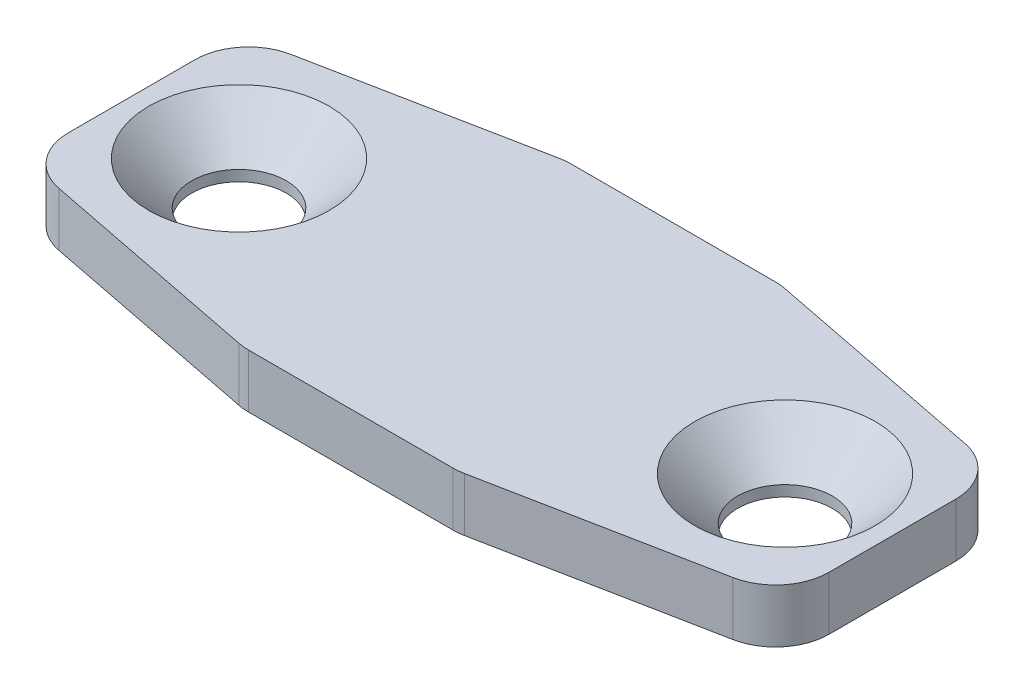
ISO-10303-21;
HEADER;
FILE_DESCRIPTION(('STEP AP214'),'2;1');
FILE_NAME('part.step','',(''),(''),'','','');
FILE_SCHEMA(('AUTOMOTIVE_DESIGN { 1 0 10303 214 1 1 1 1 }'));
ENDSEC;
DATA;
#1=APPLICATION_CONTEXT('core data for automotive mechanical design processes');
#2=APPLICATION_PROTOCOL_DEFINITION('international standard','automotive_design',2000,#1);
#3=PRODUCT_CONTEXT('',#1,'mechanical');
#4=PRODUCT('Part','Part','',(#3));
#5=PRODUCT_RELATED_PRODUCT_CATEGORY('part','',(#4));
#6=PRODUCT_DEFINITION_FORMATION('','',#4);
#7=PRODUCT_DEFINITION_CONTEXT('part definition',#1,'design');
#8=PRODUCT_DEFINITION('design','',#6,#7);
#9=PRODUCT_DEFINITION_SHAPE('','',#8);
#10=(LENGTH_UNIT() NAMED_UNIT(*) SI_UNIT(.MILLI.,.METRE.));
#11=(NAMED_UNIT(*) PLANE_ANGLE_UNIT() SI_UNIT($,.RADIAN.));
#12=(NAMED_UNIT(*) SI_UNIT($,.STERADIAN.) SOLID_ANGLE_UNIT());
#13=UNCERTAINTY_MEASURE_WITH_UNIT(LENGTH_MEASURE(1.E-05),#10,'distance_accuracy_value','');
#14=(GEOMETRIC_REPRESENTATION_CONTEXT(3) GLOBAL_UNCERTAINTY_ASSIGNED_CONTEXT((#13)) GLOBAL_UNIT_ASSIGNED_CONTEXT((#10,
#11,#12)) REPRESENTATION_CONTEXT('',''));
#15=CARTESIAN_POINT('',(0.,0.,0.));
#16=DIRECTION('',(0.,0.,1.));
#17=DIRECTION('',(1.,0.,0.));
#18=AXIS2_PLACEMENT_3D('',#15,#16,#17);
#19=CARTESIAN_POINT('',(-5.,2.5,-7.5));
#20=DIRECTION('',(0.,0.,1.));
#21=DIRECTION('',(1.,0.,0.));
#22=AXIS2_PLACEMENT_3D('',#19,#20,#21);
#23=PLANE('',#22);
#24=DIRECTION('',(-1.,0.,0.));
#25=VECTOR('',#24,1.);
#26=CARTESIAN_POINT('',(-5.,2.5,-7.5));
#27=LINE('',#26,#25);
#28=CARTESIAN_POINT('',(4.75627565188442,2.5,-7.5));
#29=VERTEX_POINT('',#28);
#30=CARTESIAN_POINT('',(-4.75627565188443,2.5,-7.5));
#31=VERTEX_POINT('',#30);
#32=EDGE_CURVE('E238',#29,#31,#27,.T.);
#33=ORIENTED_EDGE('',*,*,#32,.F.);
#34=DIRECTION('',(0.,-1.,0.));
#35=VECTOR('',#34,1.);
#36=CARTESIAN_POINT('',(4.75627565188442,2.5,-7.5));
#37=LINE('',#36,#35);
#38=CARTESIAN_POINT('',(4.75627565188442,0.,-7.5));
#39=VERTEX_POINT('',#38);
#40=EDGE_CURVE('E327',#29,#39,#37,.T.);
#41=ORIENTED_EDGE('',*,*,#40,.T.);
#42=DIRECTION('',(-1.,0.,0.));
#43=VECTOR('',#42,1.);
#44=CARTESIAN_POINT('',(-5.,0.,-7.5));
#45=LINE('',#44,#43);
#46=CARTESIAN_POINT('',(-4.75627565188443,0.,-7.5));
#47=VERTEX_POINT('',#46);
#48=EDGE_CURVE('E366',#39,#47,#45,.T.);
#49=ORIENTED_EDGE('',*,*,#48,.T.);
#50=DIRECTION('',(0.,-1.,0.));
#51=VECTOR('',#50,1.);
#52=CARTESIAN_POINT('',(-4.75627565188443,2.5,-7.5));
#53=LINE('',#52,#51);
#54=EDGE_CURVE('E324',#47,#31,#53,.F.);
#55=ORIENTED_EDGE('',*,*,#54,.T.);
#56=EDGE_LOOP('',(#33,#41,#49,#55));
#57=FACE_BOUND('',#56,.T.);
#58=ADVANCED_FACE('F41',(#57),#23,.F.);
#59=CARTESIAN_POINT('',(-17.7,2.5,-5.));
#60=DIRECTION('',(0.193143791752948,0.,0.981170462104977));
#61=DIRECTION('',(0.981170462104977,0.,-0.193143791752948));
#62=AXIS2_PLACEMENT_3D('',#59,#60,#61);
#63=PLANE('',#62);
#64=DIRECTION('',(-0.981170462104977,0.,0.193143791752948));
#65=VECTOR('',#64,1.);
#66=CARTESIAN_POINT('',(-17.7,2.5,-5.));
#67=LINE('',#66,#65);
#68=CARTESIAN_POINT('',(-5.2391351312668,2.5,-7.45292615526244));
#69=VERTEX_POINT('',#68);
#70=CARTESIAN_POINT('',(-15.6828594793824,2.5,-5.39707490563339));
#71=VERTEX_POINT('',#70);
#72=EDGE_CURVE('E357',#69,#71,#67,.T.);
#73=ORIENTED_EDGE('',*,*,#72,.F.);
#74=DIRECTION('',(0.,-1.,0.));
#75=VECTOR('',#74,1.);
#76=CARTESIAN_POINT('',(-5.23913513126679,2.5,-7.45292615526244));
#77=LINE('',#76,#75);
#78=CARTESIAN_POINT('',(-5.2391351312668,0.,-7.45292615526244));
#79=VERTEX_POINT('',#78);
#80=EDGE_CURVE('E334',#69,#79,#77,.T.);
#81=ORIENTED_EDGE('',*,*,#80,.T.);
#82=DIRECTION('',(-0.981170462104977,0.,0.193143791752948));
#83=VECTOR('',#82,1.);
#84=CARTESIAN_POINT('',(-17.7,0.,-5.));
#85=LINE('',#84,#83);
#86=CARTESIAN_POINT('',(-15.6828594793824,0.,-5.39707490563339));
#87=VERTEX_POINT('',#86);
#88=EDGE_CURVE('E364',#79,#87,#85,.T.);
#89=ORIENTED_EDGE('',*,*,#88,.T.);
#90=DIRECTION('',(0.,-1.,0.));
#91=VECTOR('',#90,1.);
#92=CARTESIAN_POINT('',(-15.6828594793824,2.5,-5.39707490563339));
#93=LINE('',#92,#91);
#94=EDGE_CURVE('E331',#87,#71,#93,.F.);
#95=ORIENTED_EDGE('',*,*,#94,.T.);
#96=EDGE_LOOP('',(#73,#81,#89,#95));
#97=FACE_BOUND('',#96,.T.);
#98=ADVANCED_FACE('F416',(#97),#63,.F.);
#99=CARTESIAN_POINT('',(-17.7,2.5,-5.));
#100=DIRECTION('',(1.,0.,0.));
#101=DIRECTION('',(0.,0.,-1.));
#102=AXIS2_PLACEMENT_3D('',#99,#100,#101);
#103=PLANE('',#102);
#104=DIRECTION('',(0.,0.,1.));
#105=VECTOR('',#104,1.);
#106=CARTESIAN_POINT('',(-17.7,2.5,-5.));
#107=LINE('',#106,#105);
#108=CARTESIAN_POINT('',(-17.7,2.5,-2.94414875037095));
#109=VERTEX_POINT('',#108);
#110=CARTESIAN_POINT('',(-17.7,2.5,2.94414875037095));
#111=VERTEX_POINT('',#110);
#112=EDGE_CURVE('E346',#109,#111,#107,.T.);
#113=ORIENTED_EDGE('',*,*,#112,.F.);
#114=DIRECTION('',(0.,-1.,0.));
#115=VECTOR('',#114,1.);
#116=CARTESIAN_POINT('',(-17.7,2.5,-2.94414875037095));
#117=LINE('',#116,#115);
#118=CARTESIAN_POINT('',(-17.7,0.,-2.94414875037095));
#119=VERTEX_POINT('',#118);
#120=EDGE_CURVE('E11',#109,#119,#117,.T.);
#121=ORIENTED_EDGE('',*,*,#120,.T.);
#122=DIRECTION('',(0.,0.,1.));
#123=VECTOR('',#122,1.);
#124=CARTESIAN_POINT('',(-17.7,0.,-5.));
#125=LINE('',#124,#123);
#126=CARTESIAN_POINT('',(-17.7,0.,2.94414875037095));
#127=VERTEX_POINT('',#126);
#128=EDGE_CURVE('E228',#119,#127,#125,.T.);
#129=ORIENTED_EDGE('',*,*,#128,.T.);
#130=DIRECTION('',(0.,-1.,0.));
#131=VECTOR('',#130,1.);
#132=CARTESIAN_POINT('',(-17.7,2.5,2.94414875037095));
#133=LINE('',#132,#131);
#134=EDGE_CURVE('E50',#127,#111,#133,.F.);
#135=ORIENTED_EDGE('',*,*,#134,.T.);
#136=EDGE_LOOP('',(#113,#121,#129,#135));
#137=FACE_BOUND('',#136,.T.);
#138=ADVANCED_FACE('F345',(#137),#103,.F.);
#139=CARTESIAN_POINT('',(-17.7,2.5,5.));
#140=DIRECTION('',(0.193143791752948,0.,-0.981170462104977));
#141=DIRECTION('',(-0.981170462104977,0.,-0.193143791752948));
#142=AXIS2_PLACEMENT_3D('',#139,#140,#141);
#143=PLANE('',#142);
#144=DIRECTION('',(0.981170462104977,0.,0.193143791752948));
#145=VECTOR('',#144,1.);
#146=CARTESIAN_POINT('',(-17.7,0.,5.));
#147=LINE('',#146,#145);
#148=CARTESIAN_POINT('',(-15.6828594793824,0.,5.39707490563339));
#149=VERTEX_POINT('',#148);
#150=CARTESIAN_POINT('',(-5.2391351312668,0.,7.45292615526244));
#151=VERTEX_POINT('',#150);
#152=EDGE_CURVE('E219',#149,#151,#147,.T.);
#153=ORIENTED_EDGE('',*,*,#152,.T.);
#154=DIRECTION('',(0.,-1.,0.));
#155=VECTOR('',#154,1.);
#156=CARTESIAN_POINT('',(-5.2391351312668,2.5,7.45292615526244));
#157=LINE('',#156,#155);
#158=CARTESIAN_POINT('',(-5.2391351312668,2.5,7.45292615526244));
#159=VERTEX_POINT('',#158);
#160=EDGE_CURVE('E194',#151,#159,#157,.F.);
#161=ORIENTED_EDGE('',*,*,#160,.T.);
#162=DIRECTION('',(0.981170462104977,0.,0.193143791752948));
#163=VECTOR('',#162,1.);
#164=CARTESIAN_POINT('',(-17.7,2.5,5.));
#165=LINE('',#164,#163);
#166=CARTESIAN_POINT('',(-15.6828594793824,2.5,5.39707490563339));
#167=VERTEX_POINT('',#166);
#168=EDGE_CURVE('E356',#167,#159,#165,.T.);
#169=ORIENTED_EDGE('',*,*,#168,.F.);
#170=DIRECTION('',(0.,-1.,0.));
#171=VECTOR('',#170,1.);
#172=CARTESIAN_POINT('',(-15.6828594793824,2.5,5.39707490563339));
#173=LINE('',#172,#171);
#174=EDGE_CURVE('E200',#167,#149,#173,.T.);
#175=ORIENTED_EDGE('',*,*,#174,.T.);
#176=EDGE_LOOP('',(#153,#161,#169,#175));
#177=FACE_BOUND('',#176,.T.);
#178=ADVANCED_FACE('F361',(#177),#143,.F.);
#179=CARTESIAN_POINT('',(-5.,2.5,7.5));
#180=DIRECTION('',(0.,0.,-1.));
#181=DIRECTION('',(-1.,0.,0.));
#182=AXIS2_PLACEMENT_3D('',#179,#180,#181);
#183=PLANE('',#182);
#184=DIRECTION('',(1.,0.,0.));
#185=VECTOR('',#184,1.);
#186=CARTESIAN_POINT('',(-5.,2.5,7.5));
#187=LINE('',#186,#185);
#188=CARTESIAN_POINT('',(-4.75627565188443,2.5,7.5));
#189=VERTEX_POINT('',#188);
#190=CARTESIAN_POINT('',(4.75627565188442,2.5,7.5));
#191=VERTEX_POINT('',#190);
#192=EDGE_CURVE('E210',#189,#191,#187,.T.);
#193=ORIENTED_EDGE('',*,*,#192,.F.);
#194=DIRECTION('',(0.,-1.,0.));
#195=VECTOR('',#194,1.);
#196=CARTESIAN_POINT('',(-4.75627565188443,2.5,7.5));
#197=LINE('',#196,#195);
#198=CARTESIAN_POINT('',(-4.75627565188443,0.,7.5));
#199=VERTEX_POINT('',#198);
#200=EDGE_CURVE('E193',#189,#199,#197,.T.);
#201=ORIENTED_EDGE('',*,*,#200,.T.);
#202=DIRECTION('',(1.,0.,0.));
#203=VECTOR('',#202,1.);
#204=CARTESIAN_POINT('',(-5.,0.,7.5));
#205=LINE('',#204,#203);
#206=CARTESIAN_POINT('',(4.75627565188442,0.,7.5));
#207=VERTEX_POINT('',#206);
#208=EDGE_CURVE('E207',#199,#207,#205,.T.);
#209=ORIENTED_EDGE('',*,*,#208,.T.);
#210=DIRECTION('',(0.,-1.,0.));
#211=VECTOR('',#210,1.);
#212=CARTESIAN_POINT('',(4.75627565188443,2.5,7.5));
#213=LINE('',#212,#211);
#214=EDGE_CURVE('E213',#207,#191,#213,.F.);
#215=ORIENTED_EDGE('',*,*,#214,.T.);
#216=EDGE_LOOP('',(#193,#201,#209,#215));
#217=FACE_BOUND('',#216,.T.);
#218=ADVANCED_FACE('F206',(#217),#183,.F.);
#219=CARTESIAN_POINT('',(17.7,2.5,4.99999999999999));
#220=DIRECTION('',(-0.193143791752949,0.,-0.981170462104977));
#221=DIRECTION('',(-0.981170462104977,0.,0.193143791752949));
#222=AXIS2_PLACEMENT_3D('',#219,#220,#221);
#223=PLANE('',#222);
#224=DIRECTION('',(0.981170462104977,0.,-0.193143791752949));
#225=VECTOR('',#224,1.);
#226=CARTESIAN_POINT('',(17.7,2.5,4.99999999999999));
#227=LINE('',#226,#225);
#228=CARTESIAN_POINT('',(5.23913513126679,2.5,7.45292615526244));
#229=VERTEX_POINT('',#228);
#230=CARTESIAN_POINT('',(15.6828594793824,2.5,5.39707490563339));
#231=VERTEX_POINT('',#230);
#232=EDGE_CURVE('E378',#229,#231,#227,.T.);
#233=ORIENTED_EDGE('',*,*,#232,.F.);
#234=DIRECTION('',(0.,-1.,0.));
#235=VECTOR('',#234,1.);
#236=CARTESIAN_POINT('',(5.2391351312668,2.5,7.45292615526244));
#237=LINE('',#236,#235);
#238=CARTESIAN_POINT('',(5.23913513126679,0.,7.45292615526244));
#239=VERTEX_POINT('',#238);
#240=EDGE_CURVE('E307',#229,#239,#237,.T.);
#241=ORIENTED_EDGE('',*,*,#240,.T.);
#242=DIRECTION('',(0.981170462104977,0.,-0.193143791752949));
#243=VECTOR('',#242,1.);
#244=CARTESIAN_POINT('',(17.7,0.,4.99999999999999));
#245=LINE('',#244,#243);
#246=CARTESIAN_POINT('',(15.6828594793824,0.,5.39707490563339));
#247=VERTEX_POINT('',#246);
#248=EDGE_CURVE('E218',#239,#247,#245,.T.);
#249=ORIENTED_EDGE('',*,*,#248,.T.);
#250=DIRECTION('',(0.,-1.,0.));
#251=VECTOR('',#250,1.);
#252=CARTESIAN_POINT('',(15.6828594793824,2.5,5.39707490563339));
#253=LINE('',#252,#251);
#254=EDGE_CURVE('E304',#247,#231,#253,.F.);
#255=ORIENTED_EDGE('',*,*,#254,.T.);
#256=EDGE_LOOP('',(#233,#241,#249,#255));
#257=FACE_BOUND('',#256,.T.);
#258=ADVANCED_FACE('F478',(#257),#223,.F.);
#259=CARTESIAN_POINT('',(17.7,2.5,-5.));
#260=DIRECTION('',(-1.,0.,0.));
#261=DIRECTION('',(0.,0.,1.));
#262=AXIS2_PLACEMENT_3D('',#259,#260,#261);
#263=PLANE('',#262);
#264=DIRECTION('',(0.,0.,-1.));
#265=VECTOR('',#264,1.);
#266=CARTESIAN_POINT('',(17.7,2.5,-5.));
#267=LINE('',#266,#265);
#268=CARTESIAN_POINT('',(17.7,2.5,2.94414875037094));
#269=VERTEX_POINT('',#268);
#270=CARTESIAN_POINT('',(17.7,2.5,-2.94414875037095));
#271=VERTEX_POINT('',#270);
#272=EDGE_CURVE('E375',#269,#271,#267,.T.);
#273=ORIENTED_EDGE('',*,*,#272,.F.);
#274=DIRECTION('',(0.,-1.,0.));
#275=VECTOR('',#274,1.);
#276=CARTESIAN_POINT('',(17.7,2.5,2.94414875037094));
#277=LINE('',#276,#275);
#278=CARTESIAN_POINT('',(17.7,0.,2.94414875037094));
#279=VERTEX_POINT('',#278);
#280=EDGE_CURVE('E314',#269,#279,#277,.T.);
#281=ORIENTED_EDGE('',*,*,#280,.T.);
#282=DIRECTION('',(0.,0.,-1.));
#283=VECTOR('',#282,1.);
#284=CARTESIAN_POINT('',(17.7,0.,-5.));
#285=LINE('',#284,#283);
#286=CARTESIAN_POINT('',(17.7,0.,-2.94414875037095));
#287=VERTEX_POINT('',#286);
#288=EDGE_CURVE('E225',#279,#287,#285,.T.);
#289=ORIENTED_EDGE('',*,*,#288,.T.);
#290=DIRECTION('',(0.,-1.,0.));
#291=VECTOR('',#290,1.);
#292=CARTESIAN_POINT('',(17.7,2.5,-2.94414875037095));
#293=LINE('',#292,#291);
#294=EDGE_CURVE('E311',#287,#271,#293,.F.);
#295=ORIENTED_EDGE('',*,*,#294,.T.);
#296=EDGE_LOOP('',(#273,#281,#289,#295));
#297=FACE_BOUND('',#296,.T.);
#298=ADVANCED_FACE('F472',(#297),#263,.F.);
#299=CARTESIAN_POINT('',(17.7,2.5,-5.));
#300=DIRECTION('',(-0.193143791752948,0.,0.981170462104977));
#301=DIRECTION('',(0.981170462104977,0.,0.193143791752948));
#302=AXIS2_PLACEMENT_3D('',#299,#300,#301);
#303=PLANE('',#302);
#304=DIRECTION('',(-0.981170462104977,0.,-0.193143791752948));
#305=VECTOR('',#304,1.);
#306=CARTESIAN_POINT('',(17.7,2.5,-5.));
#307=LINE('',#306,#305);
#308=CARTESIAN_POINT('',(15.6828594793824,2.5,-5.39707490563339));
#309=VERTEX_POINT('',#308);
#310=CARTESIAN_POINT('',(5.2391351312668,2.5,-7.45292615526244));
#311=VERTEX_POINT('',#310);
#312=EDGE_CURVE('E244',#309,#311,#307,.T.);
#313=ORIENTED_EDGE('',*,*,#312,.F.);
#314=DIRECTION('',(0.,-1.,0.));
#315=VECTOR('',#314,1.);
#316=CARTESIAN_POINT('',(15.6828594793824,2.5,-5.39707490563339));
#317=LINE('',#316,#315);
#318=CARTESIAN_POINT('',(15.6828594793824,0.,-5.39707490563339));
#319=VERTEX_POINT('',#318);
#320=EDGE_CURVE('E320',#309,#319,#317,.T.);
#321=ORIENTED_EDGE('',*,*,#320,.T.);
#322=DIRECTION('',(-0.981170462104977,0.,-0.193143791752948));
#323=VECTOR('',#322,1.);
#324=CARTESIAN_POINT('',(17.7,0.,-5.));
#325=LINE('',#324,#323);
#326=CARTESIAN_POINT('',(5.2391351312668,0.,-7.45292615526244));
#327=VERTEX_POINT('',#326);
#328=EDGE_CURVE('E235',#319,#327,#325,.T.);
#329=ORIENTED_EDGE('',*,*,#328,.T.);
#330=DIRECTION('',(0.,-1.,0.));
#331=VECTOR('',#330,1.);
#332=CARTESIAN_POINT('',(5.23913513126679,2.5,-7.45292615526244));
#333=LINE('',#332,#331);
#334=EDGE_CURVE('E60',#327,#311,#333,.F.);
#335=ORIENTED_EDGE('',*,*,#334,.T.);
#336=EDGE_LOOP('',(#313,#321,#329,#335));
#337=FACE_BOUND('',#336,.T.);
#338=ADVANCED_FACE('F466',(#337),#303,.F.);
#339=CARTESIAN_POINT('',(0.,2.5,0.));
#340=DIRECTION('',(0.,-1.,0.));
#341=DIRECTION('',(0.,0.,-1.));
#342=AXIS2_PLACEMENT_3D('',#339,#340,#341);
#343=PLANE('',#342);
#344=CARTESIAN_POINT('',(12.7,2.5,0.));
#345=DIRECTION('',(0.,-1.,0.));
#346=DIRECTION('',(0.,0.,-1.));
#347=AXIS2_PLACEMENT_3D('',#344,#345,#346);
#348=CIRCLE('',#347,4.20000000000001);
#349=CARTESIAN_POINT('',(12.7,2.5,-4.20000000000001));
#350=VERTEX_POINT('',#349);
#351=EDGE_CURVE('E248',#350,#350,#348,.T.);
#352=ORIENTED_EDGE('',*,*,#351,.T.);
#353=EDGE_LOOP('',(#352));
#354=FACE_BOUND('',#353,.T.);
#355=CARTESIAN_POINT('',(-12.7,2.5,0.));
#356=DIRECTION('',(0.,-1.,0.));
#357=DIRECTION('',(0.,0.,-1.));
#358=AXIS2_PLACEMENT_3D('',#355,#356,#357);
#359=CIRCLE('',#358,4.20000000000001);
#360=CARTESIAN_POINT('',(-12.7,2.5,-4.20000000000001));
#361=VERTEX_POINT('',#360);
#362=EDGE_CURVE('E243',#361,#361,#359,.T.);
#363=ORIENTED_EDGE('',*,*,#362,.T.);
#364=EDGE_LOOP('',(#363));
#365=FACE_BOUND('',#364,.T.);
#366=ORIENTED_EDGE('',*,*,#168,.T.);
#367=CARTESIAN_POINT('',(-4.75627565188443,2.5,5.));
#368=DIRECTION('',(0.,-1.,0.));
#369=DIRECTION('',(0.,0.,-1.));
#370=AXIS2_PLACEMENT_3D('',#367,#368,#369);
#371=CIRCLE('',#370,2.5);
#372=EDGE_CURVE('E301',#159,#189,#371,.F.);
#373=ORIENTED_EDGE('',*,*,#372,.T.);
#374=ORIENTED_EDGE('',*,*,#192,.T.);
#375=CARTESIAN_POINT('',(4.75627565188443,2.5,5.));
#376=DIRECTION('',(0.,-1.,0.));
#377=DIRECTION('',(0.,0.,-1.));
#378=AXIS2_PLACEMENT_3D('',#375,#376,#377);
#379=CIRCLE('',#378,2.5);
#380=EDGE_CURVE('E298',#191,#229,#379,.F.);
#381=ORIENTED_EDGE('',*,*,#380,.T.);
#382=ORIENTED_EDGE('',*,*,#232,.T.);
#383=CARTESIAN_POINT('',(15.2,2.5,2.94414875037094));
#384=DIRECTION('',(0.,-1.,0.));
#385=DIRECTION('',(0.,0.,-1.));
#386=AXIS2_PLACEMENT_3D('',#383,#384,#385);
#387=CIRCLE('',#386,2.5);
#388=EDGE_CURVE('E295',#231,#269,#387,.F.);
#389=ORIENTED_EDGE('',*,*,#388,.T.);
#390=ORIENTED_EDGE('',*,*,#272,.T.);
#391=CARTESIAN_POINT('',(15.2,2.5,-2.94414875037095));
#392=DIRECTION('',(0.,-1.,0.));
#393=DIRECTION('',(0.,0.,-1.));
#394=AXIS2_PLACEMENT_3D('',#391,#392,#393);
#395=CIRCLE('',#394,2.5);
#396=EDGE_CURVE('E68',#271,#309,#395,.F.);
#397=ORIENTED_EDGE('',*,*,#396,.T.);
#398=ORIENTED_EDGE('',*,*,#312,.T.);
#399=CARTESIAN_POINT('',(4.75627565188442,2.5,-5.));
#400=DIRECTION('',(0.,-1.,0.));
#401=DIRECTION('',(0.,0.,-1.));
#402=AXIS2_PLACEMENT_3D('',#399,#400,#401);
#403=CIRCLE('',#402,2.5);
#404=EDGE_CURVE('E290',#311,#29,#403,.F.);
#405=ORIENTED_EDGE('',*,*,#404,.T.);
#406=ORIENTED_EDGE('',*,*,#32,.T.);
#407=CARTESIAN_POINT('',(-4.75627565188443,2.5,-5.));
#408=DIRECTION('',(0.,-1.,0.));
#409=DIRECTION('',(0.,0.,-1.));
#410=AXIS2_PLACEMENT_3D('',#407,#408,#409);
#411=CIRCLE('',#410,2.5);
#412=EDGE_CURVE('E287',#31,#69,#411,.F.);
#413=ORIENTED_EDGE('',*,*,#412,.T.);
#414=ORIENTED_EDGE('',*,*,#72,.T.);
#415=CARTESIAN_POINT('',(-15.2,2.5,-2.94414875037095));
#416=DIRECTION('',(0.,-1.,0.));
#417=DIRECTION('',(0.,0.,-1.));
#418=AXIS2_PLACEMENT_3D('',#415,#416,#417);
#419=CIRCLE('',#418,2.5);
#420=EDGE_CURVE('E284',#71,#109,#419,.F.);
#421=ORIENTED_EDGE('',*,*,#420,.T.);
#422=ORIENTED_EDGE('',*,*,#112,.T.);
#423=CARTESIAN_POINT('',(-15.2,2.5,2.94414875037095));
#424=DIRECTION('',(0.,-1.,0.));
#425=DIRECTION('',(0.,0.,-1.));
#426=AXIS2_PLACEMENT_3D('',#423,#424,#425);
#427=CIRCLE('',#426,2.5);
#428=EDGE_CURVE('E281',#111,#167,#427,.F.);
#429=ORIENTED_EDGE('',*,*,#428,.T.);
#430=EDGE_LOOP('',(#366,#373,#374,#381,#382,#389,#390,#397,#398,#405,#406,#413,#414,#421,#422,#429));
#431=FACE_BOUND('',#430,.T.);
#432=ADVANCED_FACE('F352',(#354,#365,#431),#343,.F.);
#433=CARTESIAN_POINT('',(0.,0.,0.));
#434=DIRECTION('',(0.,-1.,0.));
#435=DIRECTION('',(0.,0.,-1.));
#436=AXIS2_PLACEMENT_3D('',#433,#434,#435);
#437=PLANE('',#436);
#438=CARTESIAN_POINT('',(12.7,0.,0.));
#439=DIRECTION('',(0.,-1.,0.));
#440=DIRECTION('',(0.,0.,-1.));
#441=AXIS2_PLACEMENT_3D('',#438,#439,#440);
#442=CIRCLE('',#441,2.2);
#443=CARTESIAN_POINT('',(12.7,0.,-2.2));
#444=VERTEX_POINT('',#443);
#445=EDGE_CURVE('E393',#444,#444,#442,.F.);
#446=ORIENTED_EDGE('',*,*,#445,.T.);
#447=EDGE_LOOP('',(#446));
#448=FACE_BOUND('',#447,.T.);
#449=CARTESIAN_POINT('',(-12.7,0.,0.));
#450=DIRECTION('',(0.,-1.,0.));
#451=DIRECTION('',(0.,0.,-1.));
#452=AXIS2_PLACEMENT_3D('',#449,#450,#451);
#453=CIRCLE('',#452,2.2);
#454=CARTESIAN_POINT('',(-12.7,0.,-2.2));
#455=VERTEX_POINT('',#454);
#456=EDGE_CURVE('E372',#455,#455,#453,.F.);
#457=ORIENTED_EDGE('',*,*,#456,.T.);
#458=EDGE_LOOP('',(#457));
#459=FACE_BOUND('',#458,.T.);
#460=ORIENTED_EDGE('',*,*,#208,.F.);
#461=CARTESIAN_POINT('',(-4.75627565188443,0.,5.));
#462=DIRECTION('',(0.,-1.,0.));
#463=DIRECTION('',(0.,0.,-1.));
#464=AXIS2_PLACEMENT_3D('',#461,#462,#463);
#465=CIRCLE('',#464,2.5);
#466=EDGE_CURVE('E189',#199,#151,#465,.T.);
#467=ORIENTED_EDGE('',*,*,#466,.T.);
#468=ORIENTED_EDGE('',*,*,#152,.F.);
#469=CARTESIAN_POINT('',(-15.2,0.,2.94414875037095));
#470=DIRECTION('',(0.,-1.,0.));
#471=DIRECTION('',(0.,0.,-1.));
#472=AXIS2_PLACEMENT_3D('',#469,#470,#471);
#473=CIRCLE('',#472,2.5);
#474=EDGE_CURVE('E212',#149,#127,#473,.T.);
#475=ORIENTED_EDGE('',*,*,#474,.T.);
#476=ORIENTED_EDGE('',*,*,#128,.F.);
#477=CARTESIAN_POINT('',(-15.2,0.,-2.94414875037095));
#478=DIRECTION('',(0.,-1.,0.));
#479=DIRECTION('',(0.,0.,-1.));
#480=AXIS2_PLACEMENT_3D('',#477,#478,#479);
#481=CIRCLE('',#480,2.5);
#482=EDGE_CURVE('E260',#119,#87,#481,.T.);
#483=ORIENTED_EDGE('',*,*,#482,.T.);
#484=ORIENTED_EDGE('',*,*,#88,.F.);
#485=CARTESIAN_POINT('',(-4.75627565188443,0.,-5.));
#486=DIRECTION('',(0.,-1.,0.));
#487=DIRECTION('',(0.,0.,-1.));
#488=AXIS2_PLACEMENT_3D('',#485,#486,#487);
#489=CIRCLE('',#488,2.5);
#490=EDGE_CURVE('E263',#79,#47,#489,.T.);
#491=ORIENTED_EDGE('',*,*,#490,.T.);
#492=ORIENTED_EDGE('',*,*,#48,.F.);
#493=CARTESIAN_POINT('',(4.75627565188442,0.,-5.));
#494=DIRECTION('',(0.,-1.,0.));
#495=DIRECTION('',(0.,0.,-1.));
#496=AXIS2_PLACEMENT_3D('',#493,#494,#495);
#497=CIRCLE('',#496,2.5);
#498=EDGE_CURVE('E265',#39,#327,#497,.T.);
#499=ORIENTED_EDGE('',*,*,#498,.T.);
#500=ORIENTED_EDGE('',*,*,#328,.F.);
#501=CARTESIAN_POINT('',(15.2,0.,-2.94414875037095));
#502=DIRECTION('',(0.,-1.,0.));
#503=DIRECTION('',(0.,0.,-1.));
#504=AXIS2_PLACEMENT_3D('',#501,#502,#503);
#505=CIRCLE('',#504,2.5);
#506=EDGE_CURVE('E268',#319,#287,#505,.T.);
#507=ORIENTED_EDGE('',*,*,#506,.T.);
#508=ORIENTED_EDGE('',*,*,#288,.F.);
#509=CARTESIAN_POINT('',(15.2,0.,2.94414875037094));
#510=DIRECTION('',(0.,-1.,0.));
#511=DIRECTION('',(0.,0.,-1.));
#512=AXIS2_PLACEMENT_3D('',#509,#510,#511);
#513=CIRCLE('',#512,2.5);
#514=EDGE_CURVE('E271',#279,#247,#513,.T.);
#515=ORIENTED_EDGE('',*,*,#514,.T.);
#516=ORIENTED_EDGE('',*,*,#248,.F.);
#517=CARTESIAN_POINT('',(4.75627565188443,0.,5.));
#518=DIRECTION('',(0.,-1.,0.));
#519=DIRECTION('',(0.,0.,-1.));
#520=AXIS2_PLACEMENT_3D('',#517,#518,#519);
#521=CIRCLE('',#520,2.5);
#522=EDGE_CURVE('E201',#239,#207,#521,.T.);
#523=ORIENTED_EDGE('',*,*,#522,.T.);
#524=EDGE_LOOP('',(#460,#467,#468,#475,#476,#483,#484,#491,#492,#499,#500,#507,#508,#515,#516,#523));
#525=FACE_BOUND('',#524,.T.);
#526=ADVANCED_FACE('F215',(#448,#459,#525),#437,.T.);
#527=CARTESIAN_POINT('',(-12.7,-0.00100000000000013,0.));
#528=DIRECTION('',(0.,1.,0.));
#529=DIRECTION('',(0.,0.,1.));
#530=AXIS2_PLACEMENT_3D('',#527,#528,#529);
#531=CYLINDRICAL_SURFACE('',#530,2.2);
#532=CARTESIAN_POINT('',(-12.7,0.499999999999997,0.));
#533=DIRECTION('',(0.,-1.,0.));
#534=DIRECTION('',(0.,0.,-1.));
#535=AXIS2_PLACEMENT_3D('',#532,#533,#534);
#536=CIRCLE('',#535,2.2);
#537=CARTESIAN_POINT('',(-12.7,0.499999999999997,-2.2));
#538=VERTEX_POINT('',#537);
#539=EDGE_CURVE('E252',#538,#538,#536,.F.);
#540=ORIENTED_EDGE('',*,*,#539,.T.);
#541=EDGE_LOOP('',(#540));
#542=FACE_BOUND('',#541,.T.);
#543=ORIENTED_EDGE('',*,*,#456,.F.);
#544=EDGE_LOOP('',(#543));
#545=FACE_BOUND('',#544,.T.);
#546=ADVANCED_FACE('F403',(#542,#545),#531,.F.);
#547=CARTESIAN_POINT('',(12.7,-0.00100000000000013,0.));
#548=DIRECTION('',(0.,1.,0.));
#549=DIRECTION('',(0.,0.,1.));
#550=AXIS2_PLACEMENT_3D('',#547,#548,#549);
#551=CYLINDRICAL_SURFACE('',#550,2.2);
#552=CARTESIAN_POINT('',(12.7,0.499999999999997,0.));
#553=DIRECTION('',(0.,-1.,0.));
#554=DIRECTION('',(0.,0.,-1.));
#555=AXIS2_PLACEMENT_3D('',#552,#553,#554);
#556=CIRCLE('',#555,2.2);
#557=CARTESIAN_POINT('',(12.7,0.499999999999997,-2.2));
#558=VERTEX_POINT('',#557);
#559=EDGE_CURVE('E239',#558,#558,#556,.F.);
#560=ORIENTED_EDGE('',*,*,#559,.T.);
#561=EDGE_LOOP('',(#560));
#562=FACE_BOUND('',#561,.T.);
#563=ORIENTED_EDGE('',*,*,#445,.F.);
#564=EDGE_LOOP('',(#563));
#565=FACE_BOUND('',#564,.T.);
#566=ADVANCED_FACE('F400',(#562,#565),#551,.F.);
#567=CARTESIAN_POINT('',(12.7,0.499999999999997,0.));
#568=DIRECTION('',(0.,1.,0.));
#569=DIRECTION('',(0.,0.,1.));
#570=AXIS2_PLACEMENT_3D('',#567,#568,#569);
#571=CONICAL_SURFACE('',#570,2.2,0.785398163397449);
#572=ORIENTED_EDGE('',*,*,#351,.F.);
#573=EDGE_LOOP('',(#572));
#574=FACE_BOUND('',#573,.T.);
#575=ORIENTED_EDGE('',*,*,#559,.F.);
#576=EDGE_LOOP('',(#575));
#577=FACE_BOUND('',#576,.T.);
#578=ADVANCED_FACE('F402',(#574,#577),#571,.F.);
#579=CARTESIAN_POINT('',(-12.7,0.499999999999997,0.));
#580=DIRECTION('',(0.,1.,0.));
#581=DIRECTION('',(0.,0.,1.));
#582=AXIS2_PLACEMENT_3D('',#579,#580,#581);
#583=CONICAL_SURFACE('',#582,2.2,0.785398163397449);
#584=ORIENTED_EDGE('',*,*,#362,.F.);
#585=EDGE_LOOP('',(#584));
#586=FACE_BOUND('',#585,.T.);
#587=ORIENTED_EDGE('',*,*,#539,.F.);
#588=EDGE_LOOP('',(#587));
#589=FACE_BOUND('',#588,.T.);
#590=ADVANCED_FACE('F410',(#586,#589),#583,.F.);
#591=CARTESIAN_POINT('',(-4.75627565188443,2.5,5.));
#592=DIRECTION('',(0.,-1.,0.));
#593=DIRECTION('',(0.,0.,-1.));
#594=AXIS2_PLACEMENT_3D('',#591,#592,#593);
#595=CYLINDRICAL_SURFACE('',#594,2.5);
#596=ORIENTED_EDGE('',*,*,#372,.F.);
#597=ORIENTED_EDGE('',*,*,#160,.F.);
#598=ORIENTED_EDGE('',*,*,#466,.F.);
#599=ORIENTED_EDGE('',*,*,#200,.F.);
#600=EDGE_LOOP('',(#596,#597,#598,#599));
#601=FACE_BOUND('',#600,.T.);
#602=ADVANCED_FACE('F192',(#601),#595,.T.);
#603=CARTESIAN_POINT('',(4.75627565188443,2.5,5.));
#604=DIRECTION('',(0.,-1.,0.));
#605=DIRECTION('',(0.,0.,-1.));
#606=AXIS2_PLACEMENT_3D('',#603,#604,#605);
#607=CYLINDRICAL_SURFACE('',#606,2.5);
#608=ORIENTED_EDGE('',*,*,#380,.F.);
#609=ORIENTED_EDGE('',*,*,#214,.F.);
#610=ORIENTED_EDGE('',*,*,#522,.F.);
#611=ORIENTED_EDGE('',*,*,#240,.F.);
#612=EDGE_LOOP('',(#608,#609,#610,#611));
#613=FACE_BOUND('',#612,.T.);
#614=ADVANCED_FACE('F432',(#613),#607,.T.);
#615=CARTESIAN_POINT('',(15.2,2.5,2.94414875037094));
#616=DIRECTION('',(0.,-1.,0.));
#617=DIRECTION('',(0.,0.,-1.));
#618=AXIS2_PLACEMENT_3D('',#615,#616,#617);
#619=CYLINDRICAL_SURFACE('',#618,2.5);
#620=ORIENTED_EDGE('',*,*,#388,.F.);
#621=ORIENTED_EDGE('',*,*,#254,.F.);
#622=ORIENTED_EDGE('',*,*,#514,.F.);
#623=ORIENTED_EDGE('',*,*,#280,.F.);
#624=EDGE_LOOP('',(#620,#621,#622,#623));
#625=FACE_BOUND('',#624,.T.);
#626=ADVANCED_FACE('F435',(#625),#619,.T.);
#627=CARTESIAN_POINT('',(15.2,2.5,-2.94414875037095));
#628=DIRECTION('',(0.,-1.,0.));
#629=DIRECTION('',(0.,0.,-1.));
#630=AXIS2_PLACEMENT_3D('',#627,#628,#629);
#631=CYLINDRICAL_SURFACE('',#630,2.5);
#632=ORIENTED_EDGE('',*,*,#396,.F.);
#633=ORIENTED_EDGE('',*,*,#294,.F.);
#634=ORIENTED_EDGE('',*,*,#506,.F.);
#635=ORIENTED_EDGE('',*,*,#320,.F.);
#636=EDGE_LOOP('',(#632,#633,#634,#635));
#637=FACE_BOUND('',#636,.T.);
#638=ADVANCED_FACE('F439',(#637),#631,.T.);
#639=CARTESIAN_POINT('',(4.75627565188442,2.5,-5.));
#640=DIRECTION('',(0.,-1.,0.));
#641=DIRECTION('',(0.,0.,-1.));
#642=AXIS2_PLACEMENT_3D('',#639,#640,#641);
#643=CYLINDRICAL_SURFACE('',#642,2.5);
#644=ORIENTED_EDGE('',*,*,#404,.F.);
#645=ORIENTED_EDGE('',*,*,#334,.F.);
#646=ORIENTED_EDGE('',*,*,#498,.F.);
#647=ORIENTED_EDGE('',*,*,#40,.F.);
#648=EDGE_LOOP('',(#644,#645,#646,#647));
#649=FACE_BOUND('',#648,.T.);
#650=ADVANCED_FACE('F443',(#649),#643,.T.);
#651=CARTESIAN_POINT('',(-4.75627565188443,2.5,-5.));
#652=DIRECTION('',(0.,-1.,0.));
#653=DIRECTION('',(0.,0.,-1.));
#654=AXIS2_PLACEMENT_3D('',#651,#652,#653);
#655=CYLINDRICAL_SURFACE('',#654,2.5);
#656=ORIENTED_EDGE('',*,*,#412,.F.);
#657=ORIENTED_EDGE('',*,*,#54,.F.);
#658=ORIENTED_EDGE('',*,*,#490,.F.);
#659=ORIENTED_EDGE('',*,*,#80,.F.);
#660=EDGE_LOOP('',(#656,#657,#658,#659));
#661=FACE_BOUND('',#660,.T.);
#662=ADVANCED_FACE('F447',(#661),#655,.T.);
#663=CARTESIAN_POINT('',(-15.2,2.5,-2.94414875037095));
#664=DIRECTION('',(0.,-1.,0.));
#665=DIRECTION('',(0.,0.,-1.));
#666=AXIS2_PLACEMENT_3D('',#663,#664,#665);
#667=CYLINDRICAL_SURFACE('',#666,2.5);
#668=ORIENTED_EDGE('',*,*,#420,.F.);
#669=ORIENTED_EDGE('',*,*,#94,.F.);
#670=ORIENTED_EDGE('',*,*,#482,.F.);
#671=ORIENTED_EDGE('',*,*,#120,.F.);
#672=EDGE_LOOP('',(#668,#669,#670,#671));
#673=FACE_BOUND('',#672,.T.);
#674=ADVANCED_FACE('F450',(#673),#667,.T.);
#675=CARTESIAN_POINT('',(-15.2,2.5,2.94414875037095));
#676=DIRECTION('',(0.,-1.,0.));
#677=DIRECTION('',(0.,0.,-1.));
#678=AXIS2_PLACEMENT_3D('',#675,#676,#677);
#679=CYLINDRICAL_SURFACE('',#678,2.5);
#680=ORIENTED_EDGE('',*,*,#428,.F.);
#681=ORIENTED_EDGE('',*,*,#134,.F.);
#682=ORIENTED_EDGE('',*,*,#474,.F.);
#683=ORIENTED_EDGE('',*,*,#174,.F.);
#684=EDGE_LOOP('',(#680,#681,#682,#683));
#685=FACE_BOUND('',#684,.T.);
#686=ADVANCED_FACE('F43',(#685),#679,.T.);
#687=CLOSED_SHELL('',(#58,#98,#138,#178,#218,#258,#298,#338,#432,#526,#546,#566,#578,#590,#602,
#614,#626,#638,#650,#662,#674,#686));
#688=MANIFOLD_SOLID_BREP('B2',#687);
#689=ADVANCED_BREP_SHAPE_REPRESENTATION('',(#18,#688),#14);
#690=SHAPE_DEFINITION_REPRESENTATION(#9,#689);
ENDSEC;
END-ISO-10303-21;
